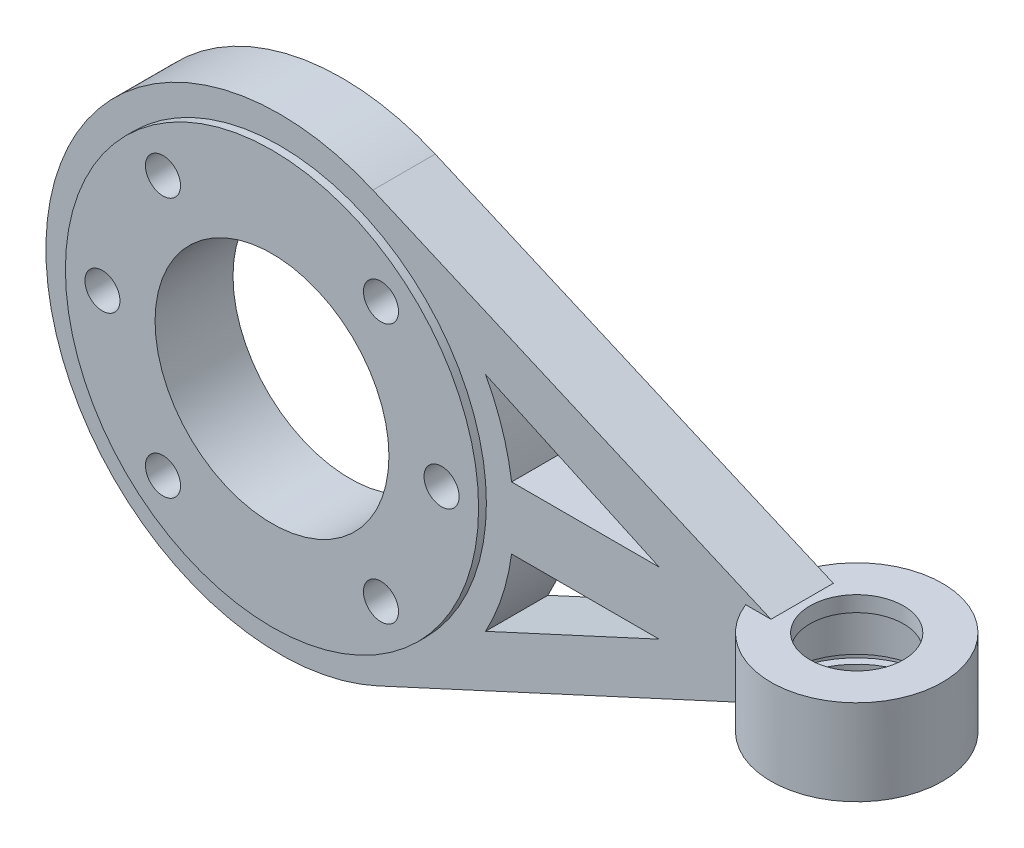
ISO-10303-21;
HEADER;
FILE_DESCRIPTION(('STEP AP214'),'2;1');
FILE_NAME('part.step','',(''),(''),'','','');
FILE_SCHEMA(('AUTOMOTIVE_DESIGN { 1 0 10303 214 1 1 1 1 }'));
ENDSEC;
DATA;
#1=APPLICATION_CONTEXT('core data for automotive mechanical design processes');
#2=APPLICATION_PROTOCOL_DEFINITION('international standard','automotive_design',2000,#1);
#3=PRODUCT_CONTEXT('',#1,'mechanical');
#4=PRODUCT('Part','Part','',(#3));
#5=PRODUCT_RELATED_PRODUCT_CATEGORY('part','',(#4));
#6=PRODUCT_DEFINITION_FORMATION('','',#4);
#7=PRODUCT_DEFINITION_CONTEXT('part definition',#1,'design');
#8=PRODUCT_DEFINITION('design','',#6,#7);
#9=PRODUCT_DEFINITION_SHAPE('','',#8);
#10=(LENGTH_UNIT() NAMED_UNIT(*) SI_UNIT(.MILLI.,.METRE.));
#11=(NAMED_UNIT(*) PLANE_ANGLE_UNIT() SI_UNIT($,.RADIAN.));
#12=(NAMED_UNIT(*) SI_UNIT($,.STERADIAN.) SOLID_ANGLE_UNIT());
#13=UNCERTAINTY_MEASURE_WITH_UNIT(LENGTH_MEASURE(1.E-05),#10,'distance_accuracy_value','');
#14=(GEOMETRIC_REPRESENTATION_CONTEXT(3) GLOBAL_UNCERTAINTY_ASSIGNED_CONTEXT((#13)) GLOBAL_UNIT_ASSIGNED_CONTEXT((#10,
#11,#12)) REPRESENTATION_CONTEXT('',''));
#15=CARTESIAN_POINT('',(0.,0.,0.));
#16=DIRECTION('',(0.,0.,1.));
#17=DIRECTION('',(1.,0.,0.));
#18=AXIS2_PLACEMENT_3D('',#15,#16,#17);
#19=CARTESIAN_POINT('',(70.,30.8308441227157,3.));
#20=DIRECTION('',(0.,-1.,0.));
#21=DIRECTION('',(0.,0.,-1.));
#22=AXIS2_PLACEMENT_3D('',#19,#20,#21);
#23=CYLINDRICAL_SURFACE('',#22,9.);
#24=CARTESIAN_POINT('',(70.,3.375,3.));
#25=DIRECTION('',(0.,1.,0.));
#26=DIRECTION('',(0.,0.,1.));
#27=AXIS2_PLACEMENT_3D('',#24,#25,#26);
#28=CIRCLE('',#27,9.);
#29=CARTESIAN_POINT('',(70.,3.375,12.));
#30=VERTEX_POINT('',#29);
#31=EDGE_CURVE('E183',#30,#30,#28,.F.);
#32=ORIENTED_EDGE('',*,*,#31,.F.);
#33=EDGE_LOOP('',(#32));
#34=FACE_BOUND('',#33,.T.);
#35=CARTESIAN_POINT('',(70.,-3.375,3.));
#36=DIRECTION('',(0.,-1.,0.));
#37=DIRECTION('',(0.,0.,-1.));
#38=AXIS2_PLACEMENT_3D('',#35,#36,#37);
#39=CIRCLE('',#38,9.);
#40=CARTESIAN_POINT('',(70.,-3.375,-6.));
#41=VERTEX_POINT('',#40);
#42=EDGE_CURVE('E168',#41,#41,#39,.T.);
#43=ORIENTED_EDGE('',*,*,#42,.T.);
#44=EDGE_LOOP('',(#43));
#45=FACE_BOUND('',#44,.T.);
#46=ADVANCED_FACE('F39',(#34,#45),#23,.F.);
#47=CARTESIAN_POINT('',(11.9375539451196,27.5226235269707,7.));
#48=DIRECTION('',(-0.397918464837319,-0.917420784232356,0.));
#49=DIRECTION('',(0.917420784232356,-0.397918464837319,0.));
#50=AXIS2_PLACEMENT_3D('',#47,#48,#49);
#51=PLANE('',#50);
#52=DIRECTION('',(-0.917420784232356,0.397918464837319,0.));
#53=VECTOR('',#52,1.);
#54=CARTESIAN_POINT('',(11.9375539451196,27.5226235269707,-1.));
#55=LINE('',#54,#53);
#56=CARTESIAN_POINT('',(63.,5.375,-1.));
#57=VERTEX_POINT('',#56);
#58=CARTESIAN_POINT('',(11.9375539451196,27.5226235269707,-1.));
#59=VERTEX_POINT('',#58);
#60=EDGE_CURVE('E202',#57,#59,#55,.T.);
#61=ORIENTED_EDGE('',*,*,#60,.T.);
#62=DIRECTION('',(0.,0.,-1.));
#63=VECTOR('',#62,1.);
#64=CARTESIAN_POINT('',(11.9375539451196,27.5226235269707,7.));
#65=LINE('',#64,#63);
#66=CARTESIAN_POINT('',(11.9375539451196,27.5226235269707,7.));
#67=VERTEX_POINT('',#66);
#68=EDGE_CURVE('E221',#67,#59,#65,.T.);
#69=ORIENTED_EDGE('',*,*,#68,.F.);
#70=DIRECTION('',(-0.917420784232356,0.397918464837319,0.));
#71=VECTOR('',#70,1.);
#72=CARTESIAN_POINT('',(11.9375539451196,27.5226235269707,7.));
#73=LINE('',#72,#71);
#74=CARTESIAN_POINT('',(63.,5.375,7.));
#75=VERTEX_POINT('',#74);
#76=EDGE_CURVE('E203',#75,#67,#73,.T.);
#77=ORIENTED_EDGE('',*,*,#76,.F.);
#78=DIRECTION('',(0.,0.,-1.));
#79=VECTOR('',#78,1.);
#80=CARTESIAN_POINT('',(63.,5.375,7.));
#81=LINE('',#80,#79);
#82=EDGE_CURVE('E223',#75,#57,#81,.T.);
#83=ORIENTED_EDGE('',*,*,#82,.T.);
#84=EDGE_LOOP('',(#61,#69,#77,#83));
#85=FACE_BOUND('',#84,.T.);
#86=ADVANCED_FACE('F305',(#85),#51,.F.);
#87=CARTESIAN_POINT('',(12.5558009643765,-27.2461348110693,7.));
#88=DIRECTION('',(-0.418526698812552,0.908204493702309,0.));
#89=DIRECTION('',(-0.908204493702309,-0.418526698812552,0.));
#90=AXIS2_PLACEMENT_3D('',#87,#88,#89);
#91=PLANE('',#90);
#92=DIRECTION('',(0.,0.,1.));
#93=VECTOR('',#92,1.);
#94=CARTESIAN_POINT('',(59.4737439536032,-5.625,7.));
#95=LINE('',#94,#93);
#96=CARTESIAN_POINT('',(59.4737439536032,-5.625,-0.193420367833634));
#97=VERTEX_POINT('',#96);
#98=CARTESIAN_POINT('',(59.4737439536032,-5.625,6.19342036783363));
#99=VERTEX_POINT('',#98);
#100=EDGE_CURVE('E232',#97,#99,#95,.T.);
#101=ORIENTED_EDGE('',*,*,#100,.T.);
#102=CARTESIAN_POINT('',(70.,-0.774199079609322,3.));
#103=DIRECTION('',(-0.418526698812552,0.908204493702309,0.));
#104=DIRECTION('',(0.908204493702309,0.418526698812552,0.));
#105=AXIS2_PLACEMENT_3D('',#102,#103,#104);
#106=ELLIPSE('',#105,12.1118097039559,11.);
#107=CARTESIAN_POINT('',(59.7530492340404,-5.49628810989938,7.));
#108=VERTEX_POINT('',#107);
#109=EDGE_CURVE('E198',#99,#108,#106,.T.);
#110=ORIENTED_EDGE('',*,*,#109,.T.);
#111=DIRECTION('',(0.908204493702309,0.418526698812552,0.));
#112=VECTOR('',#111,1.);
#113=CARTESIAN_POINT('',(12.5558009643765,-27.2461348110693,7.));
#114=LINE('',#113,#112);
#115=CARTESIAN_POINT('',(12.5558009643765,-27.2461348110693,7.));
#116=VERTEX_POINT('',#115);
#117=EDGE_CURVE('E209',#116,#108,#114,.T.);
#118=ORIENTED_EDGE('',*,*,#117,.F.);
#119=DIRECTION('',(0.,0.,-1.));
#120=VECTOR('',#119,1.);
#121=CARTESIAN_POINT('',(12.5558009643765,-27.2461348110693,7.));
#122=LINE('',#121,#120);
#123=CARTESIAN_POINT('',(12.5558009643765,-27.2461348110693,-1.));
#124=VERTEX_POINT('',#123);
#125=EDGE_CURVE('E212',#116,#124,#122,.T.);
#126=ORIENTED_EDGE('',*,*,#125,.T.);
#127=DIRECTION('',(0.908204493702309,0.418526698812552,0.));
#128=VECTOR('',#127,1.);
#129=CARTESIAN_POINT('',(12.5558009643765,-27.2461348110693,-1.));
#130=LINE('',#129,#128);
#131=CARTESIAN_POINT('',(59.7530492340404,-5.49628810989938,-1.));
#132=VERTEX_POINT('',#131);
#133=EDGE_CURVE('E207',#124,#132,#130,.T.);
#134=ORIENTED_EDGE('',*,*,#133,.T.);
#135=EDGE_CURVE('E194',#132,#97,#106,.T.);
#136=ORIENTED_EDGE('',*,*,#135,.T.);
#137=EDGE_LOOP('',(#101,#110,#118,#126,#134,#136));
#138=FACE_BOUND('',#137,.T.);
#139=ADVANCED_FACE('F319',(#138),#91,.F.);
#140=CARTESIAN_POINT('',(0.,0.,7.));
#141=DIRECTION('',(0.,0.,1.));
#142=DIRECTION('',(1.,0.,0.));
#143=AXIS2_PLACEMENT_3D('',#140,#141,#142);
#144=PLANE('',#143);
#145=CARTESIAN_POINT('',(0.,0.,7.));
#146=DIRECTION('',(0.,0.,1.));
#147=DIRECTION('',(1.,0.,0.));
#148=AXIS2_PLACEMENT_3D('',#145,#146,#147);
#149=CIRCLE('',#148,30.);
#150=CARTESIAN_POINT('',(29.732137494637,-4.,7.));
#151=VERTEX_POINT('',#150);
#152=CARTESIAN_POINT('',(26.3923216581428,-14.2634272702295,7.));
#153=VERTEX_POINT('',#152);
#154=EDGE_CURVE('E157',#151,#153,#149,.F.);
#155=ORIENTED_EDGE('',*,*,#154,.F.);
#156=DIRECTION('',(-1.,0.,0.));
#157=VECTOR('',#156,1.);
#158=CARTESIAN_POINT('',(0.,-4.,7.));
#159=LINE('',#158,#157);
#160=CARTESIAN_POINT('',(48.6639970233123,-4.,7.));
#161=VERTEX_POINT('',#160);
#162=EDGE_CURVE('E155',#161,#151,#159,.T.);
#163=ORIENTED_EDGE('',*,*,#162,.F.);
#164=DIRECTION('',(0.908204493702309,0.418526698812552,0.));
#165=VECTOR('',#164,1.);
#166=CARTESIAN_POINT('',(10.0446407715012,-21.7969078488554,7.));
#167=LINE('',#166,#165);
#168=EDGE_CURVE('E150',#153,#161,#167,.T.);
#169=ORIENTED_EDGE('',*,*,#168,.F.);
#170=EDGE_LOOP('',(#155,#163,#169));
#171=FACE_BOUND('',#170,.T.);
#172=CARTESIAN_POINT('',(0.,0.,7.));
#173=DIRECTION('',(0.,0.,1.));
#174=DIRECTION('',(1.,0.,0.));
#175=AXIS2_PLACEMENT_3D('',#172,#173,#174);
#176=CIRCLE('',#175,30.);
#177=CARTESIAN_POINT('',(26.3923216581428,14.2634272702295,7.));
#178=VERTEX_POINT('',#177);
#179=CARTESIAN_POINT('',(29.732137494637,4.,7.));
#180=VERTEX_POINT('',#179);
#181=EDGE_CURVE('E148',#178,#180,#176,.F.);
#182=ORIENTED_EDGE('',*,*,#181,.F.);
#183=DIRECTION('',(-0.908204493702309,0.418526698812552,0.));
#184=VECTOR('',#183,1.);
#185=CARTESIAN_POINT('',(10.0446407715012,21.7969078488554,7.));
#186=LINE('',#185,#184);
#187=CARTESIAN_POINT('',(48.6639970233123,4.,7.));
#188=VERTEX_POINT('',#187);
#189=EDGE_CURVE('E134',#188,#178,#186,.T.);
#190=ORIENTED_EDGE('',*,*,#189,.F.);
#191=DIRECTION('',(1.,0.,0.));
#192=VECTOR('',#191,1.);
#193=CARTESIAN_POINT('',(0.,4.,7.));
#194=LINE('',#193,#192);
#195=EDGE_CURVE('E126',#180,#188,#194,.T.);
#196=ORIENTED_EDGE('',*,*,#195,.F.);
#197=EDGE_LOOP('',(#182,#190,#196));
#198=FACE_BOUND('',#197,.T.);
#199=CARTESIAN_POINT('',(0.,0.,7.));
#200=DIRECTION('',(0.,0.,1.));
#201=DIRECTION('',(1.,0.,0.));
#202=AXIS2_PLACEMENT_3D('',#199,#200,#201);
#203=CIRCLE('',#202,26.5);
#204=CARTESIAN_POINT('',(26.5,0.,7.));
#205=VERTEX_POINT('',#204);
#206=EDGE_CURVE('E163',#205,#205,#203,.F.);
#207=ORIENTED_EDGE('',*,*,#206,.T.);
#208=EDGE_LOOP('',(#207));
#209=FACE_BOUND('',#208,.T.);
#210=DIRECTION('',(-1.,0.,0.));
#211=VECTOR('',#210,1.);
#212=CARTESIAN_POINT('',(0.,5.375,7.));
#213=LINE('',#212,#211);
#214=CARTESIAN_POINT('',(59.7530492340404,5.375,7.));
#215=VERTEX_POINT('',#214);
#216=EDGE_CURVE('E200',#75,#215,#213,.T.);
#217=ORIENTED_EDGE('',*,*,#216,.F.);
#218=ORIENTED_EDGE('',*,*,#76,.T.);
#219=CARTESIAN_POINT('',(0.,0.,7.));
#220=DIRECTION('',(0.,0.,1.));
#221=DIRECTION('',(1.,0.,0.));
#222=AXIS2_PLACEMENT_3D('',#219,#220,#221);
#223=CIRCLE('',#222,30.);
#224=EDGE_CURVE('E206',#67,#116,#223,.T.);
#225=ORIENTED_EDGE('',*,*,#224,.T.);
#226=ORIENTED_EDGE('',*,*,#117,.T.);
#227=DIRECTION('',(0.,1.,0.));
#228=VECTOR('',#227,1.);
#229=CARTESIAN_POINT('',(59.7530492340404,22.7172907254557,7.));
#230=LINE('',#229,#228);
#231=EDGE_CURVE('E197',#215,#108,#230,.F.);
#232=ORIENTED_EDGE('',*,*,#231,.F.);
#233=EDGE_LOOP('',(#217,#218,#225,#226,#232));
#234=FACE_BOUND('',#233,.T.);
#235=ADVANCED_FACE('F146',(#171,#198,#209,#234),#144,.T.);
#236=CARTESIAN_POINT('',(0.,0.,-1.));
#237=DIRECTION('',(0.,0.,1.));
#238=DIRECTION('',(1.,0.,0.));
#239=AXIS2_PLACEMENT_3D('',#236,#237,#238);
#240=PLANE('',#239);
#241=DIRECTION('',(-1.,0.,0.));
#242=VECTOR('',#241,1.);
#243=CARTESIAN_POINT('',(0.,-4.,-1.));
#244=LINE('',#243,#242);
#245=CARTESIAN_POINT('',(48.6639970233123,-4.00000000000001,-1.));
#246=VERTEX_POINT('',#245);
#247=CARTESIAN_POINT('',(29.732137494637,-4.,-1.));
#248=VERTEX_POINT('',#247);
#249=EDGE_CURVE('E47',#246,#248,#244,.T.);
#250=ORIENTED_EDGE('',*,*,#249,.T.);
#251=CARTESIAN_POINT('',(0.,0.,-1.));
#252=DIRECTION('',(0.,0.,1.));
#253=DIRECTION('',(1.,0.,0.));
#254=AXIS2_PLACEMENT_3D('',#251,#252,#253);
#255=CIRCLE('',#254,30.);
#256=CARTESIAN_POINT('',(26.3923216581428,-14.2634272702295,-1.));
#257=VERTEX_POINT('',#256);
#258=EDGE_CURVE('E12',#248,#257,#255,.F.);
#259=ORIENTED_EDGE('',*,*,#258,.T.);
#260=DIRECTION('',(0.908204493702309,0.418526698812552,0.));
#261=VECTOR('',#260,1.);
#262=CARTESIAN_POINT('',(10.0446407715012,-21.7969078488554,-1.));
#263=LINE('',#262,#261);
#264=EDGE_CURVE('E252',#257,#246,#263,.T.);
#265=ORIENTED_EDGE('',*,*,#264,.T.);
#266=EDGE_LOOP('',(#250,#259,#265));
#267=FACE_BOUND('',#266,.T.);
#268=DIRECTION('',(-0.908204493702309,0.418526698812552,0.));
#269=VECTOR('',#268,1.);
#270=CARTESIAN_POINT('',(10.0446407715012,21.7969078488554,-1.));
#271=LINE('',#270,#269);
#272=CARTESIAN_POINT('',(48.6639970233123,4.,-1.));
#273=VERTEX_POINT('',#272);
#274=CARTESIAN_POINT('',(26.3923216581428,14.2634272702295,-1.));
#275=VERTEX_POINT('',#274);
#276=EDGE_CURVE('E142',#273,#275,#271,.T.);
#277=ORIENTED_EDGE('',*,*,#276,.T.);
#278=CARTESIAN_POINT('',(0.,0.,-1.));
#279=DIRECTION('',(0.,0.,1.));
#280=DIRECTION('',(1.,0.,0.));
#281=AXIS2_PLACEMENT_3D('',#278,#279,#280);
#282=CIRCLE('',#281,30.);
#283=CARTESIAN_POINT('',(29.732137494637,4.,-1.));
#284=VERTEX_POINT('',#283);
#285=EDGE_CURVE('E249',#275,#284,#282,.F.);
#286=ORIENTED_EDGE('',*,*,#285,.T.);
#287=DIRECTION('',(1.,0.,0.));
#288=VECTOR('',#287,1.);
#289=CARTESIAN_POINT('',(0.,4.,-1.));
#290=LINE('',#289,#288);
#291=EDGE_CURVE('E242',#284,#273,#290,.T.);
#292=ORIENTED_EDGE('',*,*,#291,.T.);
#293=EDGE_LOOP('',(#277,#286,#292));
#294=FACE_BOUND('',#293,.T.);
#295=CARTESIAN_POINT('',(0.,0.,-1.));
#296=DIRECTION('',(0.,0.,1.));
#297=DIRECTION('',(1.,0.,0.));
#298=AXIS2_PLACEMENT_3D('',#295,#296,#297);
#299=CIRCLE('',#298,26.5);
#300=CARTESIAN_POINT('',(26.5,0.,-1.));
#301=VERTEX_POINT('',#300);
#302=EDGE_CURVE('E235',#301,#301,#299,.F.);
#303=ORIENTED_EDGE('',*,*,#302,.F.);
#304=EDGE_LOOP('',(#303));
#305=FACE_BOUND('',#304,.T.);
#306=ORIENTED_EDGE('',*,*,#60,.F.);
#307=DIRECTION('',(-1.,0.,0.));
#308=VECTOR('',#307,1.);
#309=CARTESIAN_POINT('',(0.,5.375,-1.));
#310=LINE('',#309,#308);
#311=CARTESIAN_POINT('',(59.7530492340404,5.375,-1.));
#312=VERTEX_POINT('',#311);
#313=EDGE_CURVE('E229',#57,#312,#310,.T.);
#314=ORIENTED_EDGE('',*,*,#313,.T.);
#315=DIRECTION('',(0.,1.,0.));
#316=VECTOR('',#315,1.);
#317=CARTESIAN_POINT('',(59.7530492340404,22.7172907254557,-1.));
#318=LINE('',#317,#316);
#319=EDGE_CURVE('E226',#312,#132,#318,.F.);
#320=ORIENTED_EDGE('',*,*,#319,.T.);
#321=ORIENTED_EDGE('',*,*,#133,.F.);
#322=CARTESIAN_POINT('',(0.,0.,-1.));
#323=DIRECTION('',(0.,0.,1.));
#324=DIRECTION('',(1.,0.,0.));
#325=AXIS2_PLACEMENT_3D('',#322,#323,#324);
#326=CIRCLE('',#325,30.);
#327=EDGE_CURVE('E215',#59,#124,#326,.T.);
#328=ORIENTED_EDGE('',*,*,#327,.F.);
#329=EDGE_LOOP('',(#306,#314,#320,#321,#328));
#330=FACE_BOUND('',#329,.T.);
#331=ADVANCED_FACE('F257',(#267,#294,#305,#330),#240,.F.);
#332=CARTESIAN_POINT('',(0.,0.,3.));
#333=DIRECTION('',(0.,0.,-1.));
#334=DIRECTION('',(-1.,0.,0.));
#335=AXIS2_PLACEMENT_3D('',#332,#333,#334);
#336=CYLINDRICAL_SURFACE('',#335,30.);
#337=ORIENTED_EDGE('',*,*,#327,.T.);
#338=ORIENTED_EDGE('',*,*,#125,.F.);
#339=ORIENTED_EDGE('',*,*,#224,.F.);
#340=ORIENTED_EDGE('',*,*,#68,.T.);
#341=EDGE_LOOP('',(#337,#338,#339,#340));
#342=FACE_BOUND('',#341,.T.);
#343=ADVANCED_FACE('F41',(#342),#336,.T.);
#344=CARTESIAN_POINT('',(59.,-5.625,3.));
#345=DIRECTION('',(0.,-1.,0.));
#346=DIRECTION('',(0.,0.,-1.));
#347=AXIS2_PLACEMENT_3D('',#344,#345,#346);
#348=PLANE('',#347);
#349=CARTESIAN_POINT('',(70.,-5.625,3.));
#350=DIRECTION('',(0.,-1.,0.));
#351=DIRECTION('',(0.,0.,-1.));
#352=AXIS2_PLACEMENT_3D('',#349,#350,#351);
#353=CIRCLE('',#352,9.);
#354=CARTESIAN_POINT('',(70.,-5.625,-6.));
#355=VERTEX_POINT('',#354);
#356=EDGE_CURVE('E176',#355,#355,#353,.T.);
#357=ORIENTED_EDGE('',*,*,#356,.F.);
#358=EDGE_LOOP('',(#357));
#359=FACE_BOUND('',#358,.T.);
#360=ORIENTED_EDGE('',*,*,#100,.F.);
#361=CARTESIAN_POINT('',(70.,-5.625,3.));
#362=DIRECTION('',(0.,1.,0.));
#363=DIRECTION('',(0.,0.,1.));
#364=AXIS2_PLACEMENT_3D('',#361,#362,#363);
#365=CIRCLE('',#364,11.);
#366=EDGE_CURVE('E187',#99,#97,#365,.T.);
#367=ORIENTED_EDGE('',*,*,#366,.F.);
#368=EDGE_LOOP('',(#360,#367));
#369=FACE_BOUND('',#368,.T.);
#370=ADVANCED_FACE('F321',(#359,#369),#348,.T.);
#371=CARTESIAN_POINT('',(70.,22.7172907254557,3.));
#372=DIRECTION('',(0.,1.,0.));
#373=DIRECTION('',(0.,0.,1.));
#374=AXIS2_PLACEMENT_3D('',#371,#372,#373);
#375=CYLINDRICAL_SURFACE('',#374,11.);
#376=ORIENTED_EDGE('',*,*,#109,.F.);
#377=ORIENTED_EDGE('',*,*,#366,.T.);
#378=ORIENTED_EDGE('',*,*,#135,.F.);
#379=ORIENTED_EDGE('',*,*,#319,.F.);
#380=CARTESIAN_POINT('',(70.,5.375,3.));
#381=DIRECTION('',(0.,1.,0.));
#382=DIRECTION('',(0.,0.,1.));
#383=AXIS2_PLACEMENT_3D('',#380,#381,#382);
#384=CIRCLE('',#383,11.);
#385=EDGE_CURVE('E190',#215,#312,#384,.T.);
#386=ORIENTED_EDGE('',*,*,#385,.F.);
#387=ORIENTED_EDGE('',*,*,#231,.T.);
#388=EDGE_LOOP('',(#376,#377,#378,#379,#386,#387));
#389=FACE_BOUND('',#388,.T.);
#390=ADVANCED_FACE('F316',(#389),#375,.T.);
#391=CARTESIAN_POINT('',(59.,5.375,3.));
#392=DIRECTION('',(0.,1.,0.));
#393=DIRECTION('',(0.,0.,1.));
#394=AXIS2_PLACEMENT_3D('',#391,#392,#393);
#395=PLANE('',#394);
#396=CARTESIAN_POINT('',(70.,5.375,3.));
#397=DIRECTION('',(0.,1.,0.));
#398=DIRECTION('',(0.,0.,1.));
#399=AXIS2_PLACEMENT_3D('',#396,#397,#398);
#400=CIRCLE('',#399,6.);
#401=CARTESIAN_POINT('',(70.,5.375,9.));
#402=VERTEX_POINT('',#401);
#403=EDGE_CURVE('E191',#402,#402,#400,.T.);
#404=ORIENTED_EDGE('',*,*,#403,.F.);
#405=EDGE_LOOP('',(#404));
#406=FACE_BOUND('',#405,.T.);
#407=ORIENTED_EDGE('',*,*,#82,.F.);
#408=ORIENTED_EDGE('',*,*,#216,.T.);
#409=ORIENTED_EDGE('',*,*,#385,.T.);
#410=ORIENTED_EDGE('',*,*,#313,.F.);
#411=EDGE_LOOP('',(#407,#408,#409,#410));
#412=FACE_BOUND('',#411,.T.);
#413=ADVANCED_FACE('F308',(#406,#412),#395,.T.);
#414=CARTESIAN_POINT('',(70.,19.375,3.));
#415=DIRECTION('',(0.,-1.,0.));
#416=DIRECTION('',(0.,0.,-1.));
#417=AXIS2_PLACEMENT_3D('',#414,#415,#416);
#418=CYLINDRICAL_SURFACE('',#417,6.);
#419=CARTESIAN_POINT('',(70.,3.375,3.));
#420=DIRECTION('',(0.,1.,0.));
#421=DIRECTION('',(0.,0.,1.));
#422=AXIS2_PLACEMENT_3D('',#419,#420,#421);
#423=CIRCLE('',#422,6.);
#424=CARTESIAN_POINT('',(70.,3.375,9.));
#425=VERTEX_POINT('',#424);
#426=EDGE_CURVE('E186',#425,#425,#423,.F.);
#427=ORIENTED_EDGE('',*,*,#426,.T.);
#428=EDGE_LOOP('',(#427));
#429=FACE_BOUND('',#428,.T.);
#430=ORIENTED_EDGE('',*,*,#403,.T.);
#431=EDGE_LOOP('',(#430));
#432=FACE_BOUND('',#431,.T.);
#433=ADVANCED_FACE('F351',(#429,#432),#418,.F.);
#434=CARTESIAN_POINT('',(59.,3.375,3.));
#435=DIRECTION('',(0.,1.,0.));
#436=DIRECTION('',(0.,0.,1.));
#437=AXIS2_PLACEMENT_3D('',#434,#435,#436);
#438=PLANE('',#437);
#439=ORIENTED_EDGE('',*,*,#31,.T.);
#440=EDGE_LOOP('',(#439));
#441=FACE_BOUND('',#440,.T.);
#442=ORIENTED_EDGE('',*,*,#426,.F.);
#443=EDGE_LOOP('',(#442));
#444=FACE_BOUND('',#443,.T.);
#445=ADVANCED_FACE('F343',(#441,#444),#438,.F.);
#446=CARTESIAN_POINT('',(70.,-4.475,3.));
#447=DIRECTION('',(0.,-1.,0.));
#448=DIRECTION('',(0.,0.,-1.));
#449=AXIS2_PLACEMENT_3D('',#446,#447,#448);
#450=CIRCLE('',#449,9.);
#451=CARTESIAN_POINT('',(70.,-4.475,-6.));
#452=VERTEX_POINT('',#451);
#453=EDGE_CURVE('E169',#452,#452,#450,.T.);
#454=ORIENTED_EDGE('',*,*,#453,.F.);
#455=EDGE_LOOP('',(#454));
#456=FACE_BOUND('',#455,.T.);
#457=ORIENTED_EDGE('',*,*,#356,.T.);
#458=EDGE_LOOP('',(#457));
#459=FACE_BOUND('',#458,.T.);
#460=ADVANCED_FACE('F333',(#456,#459),#23,.F.);
#461=CARTESIAN_POINT('',(70.,-4.475,3.));
#462=DIRECTION('',(0.,1.,0.));
#463=DIRECTION('',(0.,0.,1.));
#464=AXIS2_PLACEMENT_3D('',#461,#462,#463);
#465=CYLINDRICAL_SURFACE('',#464,9.99999999999999);
#466=CARTESIAN_POINT('',(70.,-4.475,3.));
#467=DIRECTION('',(0.,-1.,0.));
#468=DIRECTION('',(0.,0.,-1.));
#469=AXIS2_PLACEMENT_3D('',#466,#467,#468);
#470=CIRCLE('',#469,9.99999999999999);
#471=CARTESIAN_POINT('',(70.,-4.475,-6.99999999999999));
#472=VERTEX_POINT('',#471);
#473=EDGE_CURVE('E172',#472,#472,#470,.T.);
#474=ORIENTED_EDGE('',*,*,#473,.T.);
#475=EDGE_LOOP('',(#474));
#476=FACE_BOUND('',#475,.T.);
#477=CARTESIAN_POINT('',(70.,-3.375,3.));
#478=DIRECTION('',(0.,-1.,0.));
#479=DIRECTION('',(0.,0.,-1.));
#480=AXIS2_PLACEMENT_3D('',#477,#478,#479);
#481=CIRCLE('',#480,9.99999999999999);
#482=CARTESIAN_POINT('',(70.,-3.375,-6.99999999999999));
#483=VERTEX_POINT('',#482);
#484=EDGE_CURVE('E173',#483,#483,#481,.T.);
#485=ORIENTED_EDGE('',*,*,#484,.F.);
#486=EDGE_LOOP('',(#485));
#487=FACE_BOUND('',#486,.T.);
#488=ADVANCED_FACE('F342',(#476,#487),#465,.F.);
#489=CARTESIAN_POINT('',(0.,-4.475,0.));
#490=DIRECTION('',(0.,-1.,0.));
#491=DIRECTION('',(0.,0.,-1.));
#492=AXIS2_PLACEMENT_3D('',#489,#490,#491);
#493=PLANE('',#492);
#494=ORIENTED_EDGE('',*,*,#453,.T.);
#495=EDGE_LOOP('',(#494));
#496=FACE_BOUND('',#495,.T.);
#497=ORIENTED_EDGE('',*,*,#473,.F.);
#498=EDGE_LOOP('',(#497));
#499=FACE_BOUND('',#498,.T.);
#500=ADVANCED_FACE('F349',(#496,#499),#493,.F.);
#501=CARTESIAN_POINT('',(0.,-3.375,0.));
#502=DIRECTION('',(0.,-1.,0.));
#503=DIRECTION('',(0.,0.,-1.));
#504=AXIS2_PLACEMENT_3D('',#501,#502,#503);
#505=PLANE('',#504);
#506=ORIENTED_EDGE('',*,*,#42,.F.);
#507=EDGE_LOOP('',(#506));
#508=FACE_BOUND('',#507,.T.);
#509=ORIENTED_EDGE('',*,*,#484,.T.);
#510=EDGE_LOOP('',(#509));
#511=FACE_BOUND('',#510,.T.);
#512=ADVANCED_FACE('F286',(#508,#511),#505,.T.);
#513=CARTESIAN_POINT('',(0.,0.,-2.));
#514=DIRECTION('',(0.,0.,-1.));
#515=DIRECTION('',(-1.,0.,0.));
#516=AXIS2_PLACEMENT_3D('',#513,#514,#515);
#517=PLANE('',#516);
#518=CARTESIAN_POINT('',(21.75,0.,-2.));
#519=DIRECTION('',(0.,0.,-1.));
#520=DIRECTION('',(-1.,0.,0.));
#521=AXIS2_PLACEMENT_3D('',#518,#519,#520);
#522=CIRCLE('',#521,2.25);
#523=CARTESIAN_POINT('',(19.5,0.,-2.));
#524=VERTEX_POINT('',#523);
#525=EDGE_CURVE('E271',#524,#524,#522,.T.);
#526=ORIENTED_EDGE('',*,*,#525,.F.);
#527=EDGE_LOOP('',(#526));
#528=FACE_BOUND('',#527,.T.);
#529=CARTESIAN_POINT('',(-13.9806305106822,16.6614666378378,-2.));
#530=DIRECTION('',(0.,0.,-1.));
#531=DIRECTION('',(-1.,0.,0.));
#532=AXIS2_PLACEMENT_3D('',#529,#530,#531);
#533=CIRCLE('',#532,2.25);
#534=CARTESIAN_POINT('',(-16.2306305106822,16.6614666378378,-2.));
#535=VERTEX_POINT('',#534);
#536=EDGE_CURVE('E454',#535,#535,#533,.T.);
#537=ORIENTED_EDGE('',*,*,#536,.F.);
#538=EDGE_LOOP('',(#537));
#539=FACE_BOUND('',#538,.T.);
#540=CARTESIAN_POINT('',(13.9806305106822,-16.6614666378378,-2.));
#541=DIRECTION('',(0.,0.,-1.));
#542=DIRECTION('',(-1.,0.,0.));
#543=AXIS2_PLACEMENT_3D('',#540,#541,#542);
#544=CIRCLE('',#543,2.25);
#545=CARTESIAN_POINT('',(11.7306305106822,-16.6614666378378,-2.));
#546=VERTEX_POINT('',#545);
#547=EDGE_CURVE('E452',#546,#546,#544,.T.);
#548=ORIENTED_EDGE('',*,*,#547,.F.);
#549=EDGE_LOOP('',(#548));
#550=FACE_BOUND('',#549,.T.);
#551=CARTESIAN_POINT('',(-21.75,0.,-2.));
#552=DIRECTION('',(0.,0.,-1.));
#553=DIRECTION('',(-1.,0.,0.));
#554=AXIS2_PLACEMENT_3D('',#551,#552,#553);
#555=CIRCLE('',#554,2.25);
#556=CARTESIAN_POINT('',(-24.,0.,-2.));
#557=VERTEX_POINT('',#556);
#558=EDGE_CURVE('E449',#557,#557,#555,.T.);
#559=ORIENTED_EDGE('',*,*,#558,.F.);
#560=EDGE_LOOP('',(#559));
#561=FACE_BOUND('',#560,.T.);
#562=CARTESIAN_POINT('',(-13.9806305106822,-16.6614666378378,-2.));
#563=DIRECTION('',(0.,0.,-1.));
#564=DIRECTION('',(-1.,0.,0.));
#565=AXIS2_PLACEMENT_3D('',#562,#563,#564);
#566=CIRCLE('',#565,2.25);
#567=CARTESIAN_POINT('',(-16.2306305106822,-16.6614666378378,-2.));
#568=VERTEX_POINT('',#567);
#569=EDGE_CURVE('E430',#568,#568,#566,.T.);
#570=ORIENTED_EDGE('',*,*,#569,.F.);
#571=EDGE_LOOP('',(#570));
#572=FACE_BOUND('',#571,.T.);
#573=CARTESIAN_POINT('',(13.9806305106822,16.6614666378378,-2.));
#574=DIRECTION('',(0.,0.,-1.));
#575=DIRECTION('',(-1.,0.,0.));
#576=AXIS2_PLACEMENT_3D('',#573,#574,#575);
#577=CIRCLE('',#576,2.25);
#578=CARTESIAN_POINT('',(11.7306305106822,16.6614666378378,-2.));
#579=VERTEX_POINT('',#578);
#580=EDGE_CURVE('E426',#579,#579,#577,.T.);
#581=ORIENTED_EDGE('',*,*,#580,.F.);
#582=EDGE_LOOP('',(#581));
#583=FACE_BOUND('',#582,.T.);
#584=CARTESIAN_POINT('',(0.,0.,-2.));
#585=DIRECTION('',(0.,0.,-1.));
#586=DIRECTION('',(-1.,0.,0.));
#587=AXIS2_PLACEMENT_3D('',#584,#585,#586);
#588=CIRCLE('',#587,15.);
#589=CARTESIAN_POINT('',(-15.,0.,-2.));
#590=VERTEX_POINT('',#589);
#591=EDGE_CURVE('E135',#590,#590,#588,.T.);
#592=ORIENTED_EDGE('',*,*,#591,.F.);
#593=EDGE_LOOP('',(#592));
#594=FACE_BOUND('',#593,.T.);
#595=CARTESIAN_POINT('',(0.,0.,-2.));
#596=DIRECTION('',(0.,0.,-1.));
#597=DIRECTION('',(-1.,0.,0.));
#598=AXIS2_PLACEMENT_3D('',#595,#596,#597);
#599=CIRCLE('',#598,26.5);
#600=CARTESIAN_POINT('',(-26.5,0.,-2.));
#601=VERTEX_POINT('',#600);
#602=EDGE_CURVE('E160',#601,#601,#599,.T.);
#603=ORIENTED_EDGE('',*,*,#602,.T.);
#604=EDGE_LOOP('',(#603));
#605=FACE_BOUND('',#604,.T.);
#606=ADVANCED_FACE('F282',(#528,#539,#550,#561,#572,#583,#594,#605),#517,.T.);
#607=CARTESIAN_POINT('',(0.,0.,-2.));
#608=DIRECTION('',(0.,0.,1.));
#609=DIRECTION('',(1.,0.,0.));
#610=AXIS2_PLACEMENT_3D('',#607,#608,#609);
#611=CYLINDRICAL_SURFACE('',#610,26.5);
#612=ORIENTED_EDGE('',*,*,#602,.F.);
#613=EDGE_LOOP('',(#612));
#614=FACE_BOUND('',#613,.T.);
#615=ORIENTED_EDGE('',*,*,#302,.T.);
#616=EDGE_LOOP('',(#615));
#617=FACE_BOUND('',#616,.T.);
#618=ADVANCED_FACE('F285',(#614,#617),#611,.T.);
#619=ORIENTED_EDGE('',*,*,#206,.F.);
#620=EDGE_LOOP('',(#619));
#621=FACE_BOUND('',#620,.T.);
#622=CARTESIAN_POINT('',(0.,0.,8.));
#623=DIRECTION('',(0.,0.,-1.));
#624=DIRECTION('',(-1.,0.,0.));
#625=AXIS2_PLACEMENT_3D('',#622,#623,#624);
#626=CIRCLE('',#625,26.5);
#627=CARTESIAN_POINT('',(-26.5,0.,8.));
#628=VERTEX_POINT('',#627);
#629=EDGE_CURVE('E159',#628,#628,#626,.T.);
#630=ORIENTED_EDGE('',*,*,#629,.T.);
#631=EDGE_LOOP('',(#630));
#632=FACE_BOUND('',#631,.T.);
#633=ADVANCED_FACE('F293',(#621,#632),#611,.T.);
#634=CARTESIAN_POINT('',(0.,0.,8.));
#635=DIRECTION('',(0.,0.,-1.));
#636=DIRECTION('',(-1.,0.,0.));
#637=AXIS2_PLACEMENT_3D('',#634,#635,#636);
#638=PLANE('',#637);
#639=CARTESIAN_POINT('',(21.75,0.,8.));
#640=DIRECTION('',(0.,0.,1.));
#641=DIRECTION('',(1.,0.,0.));
#642=AXIS2_PLACEMENT_3D('',#639,#640,#641);
#643=CIRCLE('',#642,2.25);
#644=CARTESIAN_POINT('',(24.,0.,8.));
#645=VERTEX_POINT('',#644);
#646=EDGE_CURVE('E425',#645,#645,#643,.T.);
#647=ORIENTED_EDGE('',*,*,#646,.F.);
#648=EDGE_LOOP('',(#647));
#649=FACE_BOUND('',#648,.T.);
#650=CARTESIAN_POINT('',(-13.9806305106822,16.6614666378378,8.));
#651=DIRECTION('',(0.,0.,1.));
#652=DIRECTION('',(1.,0.,0.));
#653=AXIS2_PLACEMENT_3D('',#650,#651,#652);
#654=CIRCLE('',#653,2.25);
#655=CARTESIAN_POINT('',(-11.7306305106822,16.6614666378378,8.));
#656=VERTEX_POINT('',#655);
#657=EDGE_CURVE('E436',#656,#656,#654,.T.);
#658=ORIENTED_EDGE('',*,*,#657,.F.);
#659=EDGE_LOOP('',(#658));
#660=FACE_BOUND('',#659,.T.);
#661=CARTESIAN_POINT('',(13.9806305106822,-16.6614666378378,8.));
#662=DIRECTION('',(0.,0.,1.));
#663=DIRECTION('',(1.,0.,0.));
#664=AXIS2_PLACEMENT_3D('',#661,#662,#663);
#665=CIRCLE('',#664,2.25);
#666=CARTESIAN_POINT('',(16.2306305106822,-16.6614666378378,8.));
#667=VERTEX_POINT('',#666);
#668=EDGE_CURVE('E427',#667,#667,#665,.T.);
#669=ORIENTED_EDGE('',*,*,#668,.F.);
#670=EDGE_LOOP('',(#669));
#671=FACE_BOUND('',#670,.T.);
#672=CARTESIAN_POINT('',(-21.75,0.,8.));
#673=DIRECTION('',(0.,0.,1.));
#674=DIRECTION('',(-1.,0.,0.));
#675=AXIS2_PLACEMENT_3D('',#672,#673,#674);
#676=CIRCLE('',#675,2.25);
#677=CARTESIAN_POINT('',(-24.,0.,8.));
#678=VERTEX_POINT('',#677);
#679=EDGE_CURVE('E433',#678,#678,#676,.T.);
#680=ORIENTED_EDGE('',*,*,#679,.F.);
#681=EDGE_LOOP('',(#680));
#682=FACE_BOUND('',#681,.T.);
#683=CARTESIAN_POINT('',(-13.9806305106822,-16.6614666378378,8.));
#684=DIRECTION('',(0.,0.,1.));
#685=DIRECTION('',(-1.,0.,0.));
#686=AXIS2_PLACEMENT_3D('',#683,#684,#685);
#687=CIRCLE('',#686,2.25);
#688=CARTESIAN_POINT('',(-16.2306305106822,-16.6614666378378,8.));
#689=VERTEX_POINT('',#688);
#690=EDGE_CURVE('E440',#689,#689,#687,.T.);
#691=ORIENTED_EDGE('',*,*,#690,.F.);
#692=EDGE_LOOP('',(#691));
#693=FACE_BOUND('',#692,.T.);
#694=CARTESIAN_POINT('',(13.9806305106822,16.6614666378378,8.));
#695=DIRECTION('',(0.,0.,1.));
#696=DIRECTION('',(-1.,0.,0.));
#697=AXIS2_PLACEMENT_3D('',#694,#695,#696);
#698=CIRCLE('',#697,2.25);
#699=CARTESIAN_POINT('',(11.7306305106822,16.6614666378378,8.));
#700=VERTEX_POINT('',#699);
#701=EDGE_CURVE('E439',#700,#700,#698,.T.);
#702=ORIENTED_EDGE('',*,*,#701,.F.);
#703=EDGE_LOOP('',(#702));
#704=FACE_BOUND('',#703,.T.);
#705=CARTESIAN_POINT('',(0.,0.,8.));
#706=DIRECTION('',(0.,0.,-1.));
#707=DIRECTION('',(-1.,0.,0.));
#708=AXIS2_PLACEMENT_3D('',#705,#706,#707);
#709=CIRCLE('',#708,15.);
#710=CARTESIAN_POINT('',(-15.,0.,8.));
#711=VERTEX_POINT('',#710);
#712=EDGE_CURVE('E243',#711,#711,#709,.T.);
#713=ORIENTED_EDGE('',*,*,#712,.T.);
#714=EDGE_LOOP('',(#713));
#715=FACE_BOUND('',#714,.T.);
#716=ORIENTED_EDGE('',*,*,#629,.F.);
#717=EDGE_LOOP('',(#716));
#718=FACE_BOUND('',#717,.T.);
#719=ADVANCED_FACE('F372',(#649,#660,#671,#682,#693,#704,#715,#718),#638,.F.);
#720=CARTESIAN_POINT('',(0.,0.,-8.));
#721=DIRECTION('',(0.,0.,1.));
#722=DIRECTION('',(1.,0.,0.));
#723=AXIS2_PLACEMENT_3D('',#720,#721,#722);
#724=CYLINDRICAL_SURFACE('',#723,15.);
#725=ORIENTED_EDGE('',*,*,#591,.T.);
#726=EDGE_LOOP('',(#725));
#727=FACE_BOUND('',#726,.T.);
#728=ORIENTED_EDGE('',*,*,#712,.F.);
#729=EDGE_LOOP('',(#728));
#730=FACE_BOUND('',#729,.T.);
#731=ADVANCED_FACE('F279',(#727,#730),#724,.F.);
#732=CARTESIAN_POINT('',(0.,0.,-8.));
#733=DIRECTION('',(0.,0.,1.));
#734=DIRECTION('',(1.,0.,0.));
#735=AXIS2_PLACEMENT_3D('',#732,#733,#734);
#736=CYLINDRICAL_SURFACE('',#735,30.);
#737=ORIENTED_EDGE('',*,*,#181,.T.);
#738=DIRECTION('',(0.,0.,1.));
#739=VECTOR('',#738,1.);
#740=CARTESIAN_POINT('',(29.732137494637,4.,-8.));
#741=LINE('',#740,#739);
#742=EDGE_CURVE('E62',#284,#180,#741,.T.);
#743=ORIENTED_EDGE('',*,*,#742,.F.);
#744=ORIENTED_EDGE('',*,*,#285,.F.);
#745=DIRECTION('',(0.,0.,1.));
#746=VECTOR('',#745,1.);
#747=CARTESIAN_POINT('',(26.3923216581428,14.2634272702295,-8.));
#748=LINE('',#747,#746);
#749=EDGE_CURVE('E144',#275,#178,#748,.T.);
#750=ORIENTED_EDGE('',*,*,#749,.T.);
#751=EDGE_LOOP('',(#737,#743,#744,#750));
#752=FACE_BOUND('',#751,.T.);
#753=ADVANCED_FACE('F377',(#752),#736,.T.);
#754=CARTESIAN_POINT('',(26.3923216581428,14.2634272702295,-8.));
#755=DIRECTION('',(0.418526698812552,0.908204493702309,0.));
#756=DIRECTION('',(-0.908204493702309,0.418526698812552,0.));
#757=AXIS2_PLACEMENT_3D('',#754,#755,#756);
#758=PLANE('',#757);
#759=ORIENTED_EDGE('',*,*,#189,.T.);
#760=ORIENTED_EDGE('',*,*,#749,.F.);
#761=ORIENTED_EDGE('',*,*,#276,.F.);
#762=DIRECTION('',(0.,0.,1.));
#763=VECTOR('',#762,1.);
#764=CARTESIAN_POINT('',(48.6639970233123,4.,-8.));
#765=LINE('',#764,#763);
#766=EDGE_CURVE('E129',#273,#188,#765,.T.);
#767=ORIENTED_EDGE('',*,*,#766,.T.);
#768=EDGE_LOOP('',(#759,#760,#761,#767));
#769=FACE_BOUND('',#768,.T.);
#770=ADVANCED_FACE('F138',(#769),#758,.F.);
#771=CARTESIAN_POINT('',(29.732137494637,4.,-8.));
#772=DIRECTION('',(0.,-1.,0.));
#773=DIRECTION('',(0.,0.,-1.));
#774=AXIS2_PLACEMENT_3D('',#771,#772,#773);
#775=PLANE('',#774);
#776=ORIENTED_EDGE('',*,*,#195,.T.);
#777=ORIENTED_EDGE('',*,*,#766,.F.);
#778=ORIENTED_EDGE('',*,*,#291,.F.);
#779=ORIENTED_EDGE('',*,*,#742,.T.);
#780=EDGE_LOOP('',(#776,#777,#778,#779));
#781=FACE_BOUND('',#780,.T.);
#782=ADVANCED_FACE('F128',(#781),#775,.F.);
#783=CARTESIAN_POINT('',(0.,0.,-8.));
#784=DIRECTION('',(0.,0.,1.));
#785=DIRECTION('',(1.,0.,0.));
#786=AXIS2_PLACEMENT_3D('',#783,#784,#785);
#787=CYLINDRICAL_SURFACE('',#786,30.);
#788=ORIENTED_EDGE('',*,*,#154,.T.);
#789=DIRECTION('',(0.,0.,1.));
#790=VECTOR('',#789,1.);
#791=CARTESIAN_POINT('',(26.3923216581428,-14.2634272702295,-8.));
#792=LINE('',#791,#790);
#793=EDGE_CURVE('E54',#257,#153,#792,.T.);
#794=ORIENTED_EDGE('',*,*,#793,.F.);
#795=ORIENTED_EDGE('',*,*,#258,.F.);
#796=DIRECTION('',(0.,0.,1.));
#797=VECTOR('',#796,1.);
#798=CARTESIAN_POINT('',(29.732137494637,-4.,-8.));
#799=LINE('',#798,#797);
#800=EDGE_CURVE('E246',#248,#151,#799,.T.);
#801=ORIENTED_EDGE('',*,*,#800,.T.);
#802=EDGE_LOOP('',(#788,#794,#795,#801));
#803=FACE_BOUND('',#802,.T.);
#804=ADVANCED_FACE('F383',(#803),#787,.T.);
#805=CARTESIAN_POINT('',(29.732137494637,-4.,-8.));
#806=DIRECTION('',(0.,1.,0.));
#807=DIRECTION('',(0.,0.,1.));
#808=AXIS2_PLACEMENT_3D('',#805,#806,#807);
#809=PLANE('',#808);
#810=ORIENTED_EDGE('',*,*,#162,.T.);
#811=ORIENTED_EDGE('',*,*,#800,.F.);
#812=ORIENTED_EDGE('',*,*,#249,.F.);
#813=DIRECTION('',(0.,0.,1.));
#814=VECTOR('',#813,1.);
#815=CARTESIAN_POINT('',(48.6639970233123,-4.,-8.));
#816=LINE('',#815,#814);
#817=EDGE_CURVE('E263',#246,#161,#816,.T.);
#818=ORIENTED_EDGE('',*,*,#817,.T.);
#819=EDGE_LOOP('',(#810,#811,#812,#818));
#820=FACE_BOUND('',#819,.T.);
#821=ADVANCED_FACE('F262',(#820),#809,.F.);
#822=CARTESIAN_POINT('',(26.3923216581428,-14.2634272702295,-8.));
#823=DIRECTION('',(0.418526698812552,-0.908204493702309,0.));
#824=DIRECTION('',(0.908204493702309,0.418526698812552,0.));
#825=AXIS2_PLACEMENT_3D('',#822,#823,#824);
#826=PLANE('',#825);
#827=ORIENTED_EDGE('',*,*,#168,.T.);
#828=ORIENTED_EDGE('',*,*,#817,.F.);
#829=ORIENTED_EDGE('',*,*,#264,.F.);
#830=ORIENTED_EDGE('',*,*,#793,.T.);
#831=EDGE_LOOP('',(#827,#828,#829,#830));
#832=FACE_BOUND('',#831,.T.);
#833=ADVANCED_FACE('F388',(#832),#826,.F.);
#834=CARTESIAN_POINT('',(13.9806305106822,16.6614666378378,-9.));
#835=DIRECTION('',(0.,0.,1.));
#836=DIRECTION('',(1.,0.,0.));
#837=AXIS2_PLACEMENT_3D('',#834,#835,#836);
#838=CYLINDRICAL_SURFACE('',#837,2.25);
#839=ORIENTED_EDGE('',*,*,#580,.T.);
#840=EDGE_LOOP('',(#839));
#841=FACE_BOUND('',#840,.T.);
#842=ORIENTED_EDGE('',*,*,#701,.T.);
#843=EDGE_LOOP('',(#842));
#844=FACE_BOUND('',#843,.T.);
#845=ADVANCED_FACE('F391',(#841,#844),#838,.F.);
#846=CARTESIAN_POINT('',(-13.9806305106822,-16.6614666378378,-9.));
#847=DIRECTION('',(0.,0.,1.));
#848=DIRECTION('',(1.,0.,0.));
#849=AXIS2_PLACEMENT_3D('',#846,#847,#848);
#850=CYLINDRICAL_SURFACE('',#849,2.25);
#851=ORIENTED_EDGE('',*,*,#569,.T.);
#852=EDGE_LOOP('',(#851));
#853=FACE_BOUND('',#852,.T.);
#854=ORIENTED_EDGE('',*,*,#690,.T.);
#855=EDGE_LOOP('',(#854));
#856=FACE_BOUND('',#855,.T.);
#857=ADVANCED_FACE('F400',(#853,#856),#850,.F.);
#858=CARTESIAN_POINT('',(-21.75,0.,-9.));
#859=DIRECTION('',(0.,0.,1.));
#860=DIRECTION('',(1.,0.,0.));
#861=AXIS2_PLACEMENT_3D('',#858,#859,#860);
#862=CYLINDRICAL_SURFACE('',#861,2.25);
#863=ORIENTED_EDGE('',*,*,#558,.T.);
#864=EDGE_LOOP('',(#863));
#865=FACE_BOUND('',#864,.T.);
#866=ORIENTED_EDGE('',*,*,#679,.T.);
#867=EDGE_LOOP('',(#866));
#868=FACE_BOUND('',#867,.T.);
#869=ADVANCED_FACE('F396',(#865,#868),#862,.F.);
#870=CARTESIAN_POINT('',(13.9806305106822,-16.6614666378378,-9.));
#871=DIRECTION('',(0.,0.,1.));
#872=DIRECTION('',(1.,0.,0.));
#873=AXIS2_PLACEMENT_3D('',#870,#871,#872);
#874=CYLINDRICAL_SURFACE('',#873,2.25);
#875=ORIENTED_EDGE('',*,*,#547,.T.);
#876=EDGE_LOOP('',(#875));
#877=FACE_BOUND('',#876,.T.);
#878=ORIENTED_EDGE('',*,*,#668,.T.);
#879=EDGE_LOOP('',(#878));
#880=FACE_BOUND('',#879,.T.);
#881=ADVANCED_FACE('F399',(#877,#880),#874,.F.);
#882=CARTESIAN_POINT('',(-13.9806305106822,16.6614666378378,-9.));
#883=DIRECTION('',(0.,0.,1.));
#884=DIRECTION('',(1.,0.,0.));
#885=AXIS2_PLACEMENT_3D('',#882,#883,#884);
#886=CYLINDRICAL_SURFACE('',#885,2.25);
#887=ORIENTED_EDGE('',*,*,#536,.T.);
#888=EDGE_LOOP('',(#887));
#889=FACE_BOUND('',#888,.T.);
#890=ORIENTED_EDGE('',*,*,#657,.T.);
#891=EDGE_LOOP('',(#890));
#892=FACE_BOUND('',#891,.T.);
#893=ADVANCED_FACE('F404',(#889,#892),#886,.F.);
#894=CARTESIAN_POINT('',(21.75,0.,-9.));
#895=DIRECTION('',(0.,0.,1.));
#896=DIRECTION('',(1.,0.,0.));
#897=AXIS2_PLACEMENT_3D('',#894,#895,#896);
#898=CYLINDRICAL_SURFACE('',#897,2.25);
#899=ORIENTED_EDGE('',*,*,#525,.T.);
#900=EDGE_LOOP('',(#899));
#901=FACE_BOUND('',#900,.T.);
#902=ORIENTED_EDGE('',*,*,#646,.T.);
#903=EDGE_LOOP('',(#902));
#904=FACE_BOUND('',#903,.T.);
#905=ADVANCED_FACE('F414',(#901,#904),#898,.F.);
#906=CLOSED_SHELL('',(#46,#86,#139,#235,#331,#343,#370,#390,#413,#433,#445,#460,#488,#500,#512,
#606,#618,#633,#719,#731,#753,#770,#782,#804,#821,#833,#845,#857,#869,#881,#893,#905));
#907=MANIFOLD_SOLID_BREP('B2',#906);
#908=ADVANCED_BREP_SHAPE_REPRESENTATION('',(#18,#907),#14);
#909=SHAPE_DEFINITION_REPRESENTATION(#9,#908);
ENDSEC;
END-ISO-10303-21;
